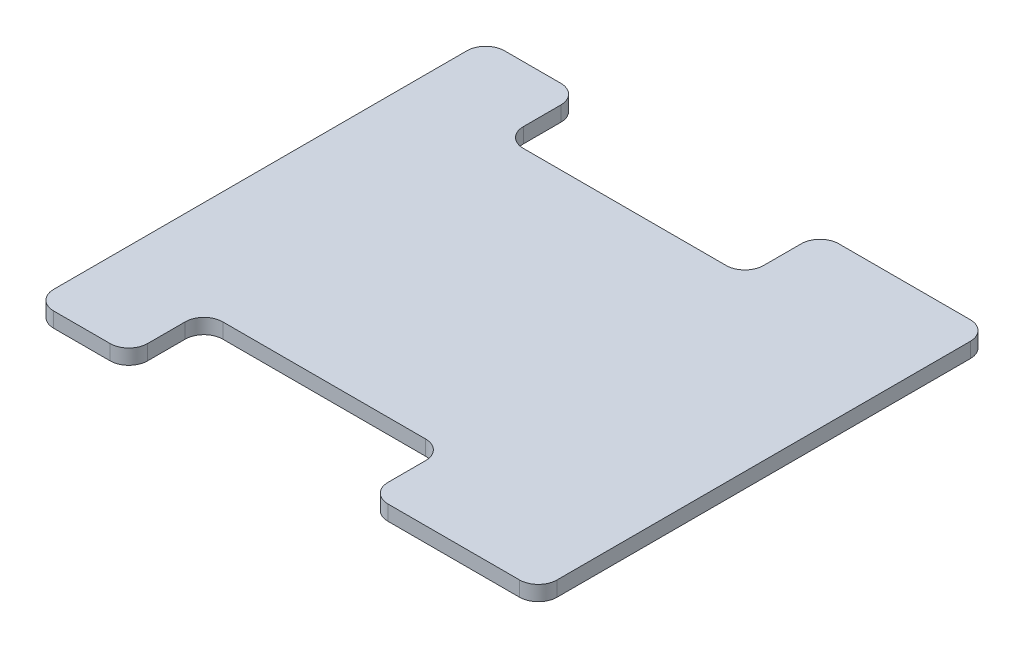
ISO-10303-21;
HEADER;
FILE_DESCRIPTION(('STEP AP214'),'2;1');
FILE_NAME('part.step','',(''),(''),'','','');
FILE_SCHEMA(('AUTOMOTIVE_DESIGN { 1 0 10303 214 1 1 1 1 }'));
ENDSEC;
DATA;
#1=APPLICATION_CONTEXT('core data for automotive mechanical design processes');
#2=APPLICATION_PROTOCOL_DEFINITION('international standard','automotive_design',2000,#1);
#3=PRODUCT_CONTEXT('',#1,'mechanical');
#4=PRODUCT('Part','Part','',(#3));
#5=PRODUCT_RELATED_PRODUCT_CATEGORY('part','',(#4));
#6=PRODUCT_DEFINITION_FORMATION('','',#4);
#7=PRODUCT_DEFINITION_CONTEXT('part definition',#1,'design');
#8=PRODUCT_DEFINITION('design','',#6,#7);
#9=PRODUCT_DEFINITION_SHAPE('','',#8);
#10=(LENGTH_UNIT() NAMED_UNIT(*) SI_UNIT(.MILLI.,.METRE.));
#11=(NAMED_UNIT(*) PLANE_ANGLE_UNIT() SI_UNIT($,.RADIAN.));
#12=(NAMED_UNIT(*) SI_UNIT($,.STERADIAN.) SOLID_ANGLE_UNIT());
#13=UNCERTAINTY_MEASURE_WITH_UNIT(LENGTH_MEASURE(1.E-05),#10,'distance_accuracy_value','');
#14=(GEOMETRIC_REPRESENTATION_CONTEXT(3) GLOBAL_UNCERTAINTY_ASSIGNED_CONTEXT((#13)) GLOBAL_UNIT_ASSIGNED_CONTEXT((#10,
#11,#12)) REPRESENTATION_CONTEXT('',''));
#15=CARTESIAN_POINT('',(0.,0.,0.));
#16=DIRECTION('',(0.,0.,1.));
#17=DIRECTION('',(1.,0.,0.));
#18=AXIS2_PLACEMENT_3D('',#15,#16,#17);
#19=CARTESIAN_POINT('',(62.,4.,55.));
#20=DIRECTION('',(0.,-1.,0.));
#21=DIRECTION('',(0.,0.,-1.));
#22=AXIS2_PLACEMENT_3D('',#19,#20,#21);
#23=CYLINDRICAL_SURFACE('',#22,4.99999999999999);
#24=CARTESIAN_POINT('',(62.,0.,55.));
#25=DIRECTION('',(0.,1.,0.));
#26=DIRECTION('',(0.,0.,-1.));
#27=AXIS2_PLACEMENT_3D('',#24,#25,#26);
#28=CIRCLE('',#27,4.99999999999999);
#29=CARTESIAN_POINT('',(62.,0.,60.));
#30=VERTEX_POINT('',#29);
#31=CARTESIAN_POINT('',(67.,0.,55.));
#32=VERTEX_POINT('',#31);
#33=EDGE_CURVE('E225',#30,#32,#28,.T.);
#34=ORIENTED_EDGE('',*,*,#33,.T.);
#35=DIRECTION('',(0.,-1.,0.));
#36=VECTOR('',#35,1.);
#37=CARTESIAN_POINT('',(67.,4.,55.));
#38=LINE('',#37,#36);
#39=CARTESIAN_POINT('',(67.,4.,55.));
#40=VERTEX_POINT('',#39);
#41=EDGE_CURVE('E11',#40,#32,#38,.T.);
#42=ORIENTED_EDGE('',*,*,#41,.F.);
#43=CARTESIAN_POINT('',(62.,4.,55.));
#44=DIRECTION('',(0.,1.,0.));
#45=DIRECTION('',(0.,0.,-1.));
#46=AXIS2_PLACEMENT_3D('',#43,#44,#45);
#47=CIRCLE('',#46,4.99999999999999);
#48=CARTESIAN_POINT('',(62.,4.,60.));
#49=VERTEX_POINT('',#48);
#50=EDGE_CURVE('E271',#49,#40,#47,.T.);
#51=ORIENTED_EDGE('',*,*,#50,.F.);
#52=DIRECTION('',(0.,-1.,0.));
#53=VECTOR('',#52,1.);
#54=CARTESIAN_POINT('',(62.,4.,60.));
#55=LINE('',#54,#53);
#56=EDGE_CURVE('E221',#49,#30,#55,.T.);
#57=ORIENTED_EDGE('',*,*,#56,.T.);
#58=EDGE_LOOP('',(#34,#42,#51,#57));
#59=FACE_BOUND('',#58,.T.);
#60=ADVANCED_FACE('F33',(#59),#23,.T.);
#61=CARTESIAN_POINT('',(67.,4.,-55.));
#62=DIRECTION('',(-1.,0.,0.));
#63=DIRECTION('',(0.,0.,1.));
#64=AXIS2_PLACEMENT_3D('',#61,#62,#63);
#65=PLANE('',#64);
#66=DIRECTION('',(0.,0.,-1.));
#67=VECTOR('',#66,1.);
#68=CARTESIAN_POINT('',(67.,0.,-55.));
#69=LINE('',#68,#67);
#70=CARTESIAN_POINT('',(67.,0.,-55.));
#71=VERTEX_POINT('',#70);
#72=EDGE_CURVE('E228',#32,#71,#69,.T.);
#73=ORIENTED_EDGE('',*,*,#72,.T.);
#74=DIRECTION('',(0.,-1.,0.));
#75=VECTOR('',#74,1.);
#76=CARTESIAN_POINT('',(67.,4.,-55.));
#77=LINE('',#76,#75);
#78=CARTESIAN_POINT('',(67.,4.,-55.));
#79=VERTEX_POINT('',#78);
#80=EDGE_CURVE('E41',#79,#71,#77,.T.);
#81=ORIENTED_EDGE('',*,*,#80,.F.);
#82=DIRECTION('',(0.,0.,-1.));
#83=VECTOR('',#82,1.);
#84=CARTESIAN_POINT('',(67.,4.,-55.));
#85=LINE('',#84,#83);
#86=EDGE_CURVE('E140',#40,#79,#85,.T.);
#87=ORIENTED_EDGE('',*,*,#86,.F.);
#88=ORIENTED_EDGE('',*,*,#41,.T.);
#89=EDGE_LOOP('',(#73,#81,#87,#88));
#90=FACE_BOUND('',#89,.T.);
#91=ADVANCED_FACE('F409',(#90),#65,.F.);
#92=CARTESIAN_POINT('',(62.,4.,-55.));
#93=DIRECTION('',(0.,-1.,0.));
#94=DIRECTION('',(0.,0.,-1.));
#95=AXIS2_PLACEMENT_3D('',#92,#93,#94);
#96=CYLINDRICAL_SURFACE('',#95,5.);
#97=CARTESIAN_POINT('',(62.,0.,-55.));
#98=DIRECTION('',(0.,1.,0.));
#99=DIRECTION('',(0.,0.,-1.));
#100=AXIS2_PLACEMENT_3D('',#97,#98,#99);
#101=CIRCLE('',#100,5.);
#102=CARTESIAN_POINT('',(62.,0.,-60.));
#103=VERTEX_POINT('',#102);
#104=EDGE_CURVE('E230',#71,#103,#101,.T.);
#105=ORIENTED_EDGE('',*,*,#104,.T.);
#106=DIRECTION('',(0.,-1.,0.));
#107=VECTOR('',#106,1.);
#108=CARTESIAN_POINT('',(62.,4.,-60.));
#109=LINE('',#108,#107);
#110=CARTESIAN_POINT('',(62.,4.,-60.));
#111=VERTEX_POINT('',#110);
#112=EDGE_CURVE('E326',#111,#103,#109,.T.);
#113=ORIENTED_EDGE('',*,*,#112,.F.);
#114=CARTESIAN_POINT('',(62.,4.,-55.));
#115=DIRECTION('',(0.,1.,0.));
#116=DIRECTION('',(0.,0.,-1.));
#117=AXIS2_PLACEMENT_3D('',#114,#115,#116);
#118=CIRCLE('',#117,5.);
#119=EDGE_CURVE('E334',#79,#111,#118,.T.);
#120=ORIENTED_EDGE('',*,*,#119,.F.);
#121=ORIENTED_EDGE('',*,*,#80,.T.);
#122=EDGE_LOOP('',(#105,#113,#120,#121));
#123=FACE_BOUND('',#122,.T.);
#124=ADVANCED_FACE('F332',(#123),#96,.T.);
#125=CARTESIAN_POINT('',(62.,4.,-60.));
#126=DIRECTION('',(0.,0.,1.));
#127=DIRECTION('',(1.,0.,0.));
#128=AXIS2_PLACEMENT_3D('',#125,#126,#127);
#129=PLANE('',#128);
#130=DIRECTION('',(-1.,0.,0.));
#131=VECTOR('',#130,1.);
#132=CARTESIAN_POINT('',(62.,0.,-60.));
#133=LINE('',#132,#131);
#134=CARTESIAN_POINT('',(27.,0.,-60.));
#135=VERTEX_POINT('',#134);
#136=EDGE_CURVE('E232',#103,#135,#133,.T.);
#137=ORIENTED_EDGE('',*,*,#136,.T.);
#138=DIRECTION('',(0.,-1.,0.));
#139=VECTOR('',#138,1.);
#140=CARTESIAN_POINT('',(27.,4.,-60.));
#141=LINE('',#140,#139);
#142=CARTESIAN_POINT('',(27.,4.,-60.));
#143=VERTEX_POINT('',#142);
#144=EDGE_CURVE('E323',#143,#135,#141,.T.);
#145=ORIENTED_EDGE('',*,*,#144,.F.);
#146=DIRECTION('',(-1.,0.,0.));
#147=VECTOR('',#146,1.);
#148=CARTESIAN_POINT('',(62.,4.,-60.));
#149=LINE('',#148,#147);
#150=EDGE_CURVE('E352',#111,#143,#149,.T.);
#151=ORIENTED_EDGE('',*,*,#150,.F.);
#152=ORIENTED_EDGE('',*,*,#112,.T.);
#153=EDGE_LOOP('',(#137,#145,#151,#152));
#154=FACE_BOUND('',#153,.T.);
#155=ADVANCED_FACE('F343',(#154),#129,.F.);
#156=CARTESIAN_POINT('',(27.,4.,-55.));
#157=DIRECTION('',(0.,-1.,0.));
#158=DIRECTION('',(0.,0.,-1.));
#159=AXIS2_PLACEMENT_3D('',#156,#157,#158);
#160=CYLINDRICAL_SURFACE('',#159,5.);
#161=CARTESIAN_POINT('',(27.,0.,-55.));
#162=DIRECTION('',(0.,1.,0.));
#163=DIRECTION('',(0.,0.,1.));
#164=AXIS2_PLACEMENT_3D('',#161,#162,#163);
#165=CIRCLE('',#164,5.);
#166=CARTESIAN_POINT('',(22.,0.,-55.));
#167=VERTEX_POINT('',#166);
#168=EDGE_CURVE('E234',#135,#167,#165,.T.);
#169=ORIENTED_EDGE('',*,*,#168,.T.);
#170=DIRECTION('',(0.,-1.,0.));
#171=VECTOR('',#170,1.);
#172=CARTESIAN_POINT('',(22.,4.,-55.));
#173=LINE('',#172,#171);
#174=CARTESIAN_POINT('',(22.,4.,-55.));
#175=VERTEX_POINT('',#174);
#176=EDGE_CURVE('E320',#175,#167,#173,.T.);
#177=ORIENTED_EDGE('',*,*,#176,.F.);
#178=CARTESIAN_POINT('',(27.,4.,-55.));
#179=DIRECTION('',(0.,1.,0.));
#180=DIRECTION('',(0.,0.,1.));
#181=AXIS2_PLACEMENT_3D('',#178,#179,#180);
#182=CIRCLE('',#181,5.);
#183=EDGE_CURVE('E349',#143,#175,#182,.T.);
#184=ORIENTED_EDGE('',*,*,#183,.F.);
#185=ORIENTED_EDGE('',*,*,#144,.T.);
#186=EDGE_LOOP('',(#169,#177,#184,#185));
#187=FACE_BOUND('',#186,.T.);
#188=ADVANCED_FACE('F347',(#187),#160,.T.);
#189=CARTESIAN_POINT('',(22.,4.,-55.));
#190=DIRECTION('',(1.,0.,0.));
#191=DIRECTION('',(0.,0.,-1.));
#192=AXIS2_PLACEMENT_3D('',#189,#190,#191);
#193=PLANE('',#192);
#194=DIRECTION('',(0.,0.,1.));
#195=VECTOR('',#194,1.);
#196=CARTESIAN_POINT('',(22.,0.,-55.));
#197=LINE('',#196,#195);
#198=CARTESIAN_POINT('',(22.,0.,-45.));
#199=VERTEX_POINT('',#198);
#200=EDGE_CURVE('E236',#167,#199,#197,.T.);
#201=ORIENTED_EDGE('',*,*,#200,.T.);
#202=DIRECTION('',(0.,-1.,0.));
#203=VECTOR('',#202,1.);
#204=CARTESIAN_POINT('',(22.,4.,-45.));
#205=LINE('',#204,#203);
#206=CARTESIAN_POINT('',(22.,4.,-45.));
#207=VERTEX_POINT('',#206);
#208=EDGE_CURVE('E317',#207,#199,#205,.T.);
#209=ORIENTED_EDGE('',*,*,#208,.F.);
#210=DIRECTION('',(0.,0.,1.));
#211=VECTOR('',#210,1.);
#212=CARTESIAN_POINT('',(22.,4.,-55.));
#213=LINE('',#212,#211);
#214=EDGE_CURVE('E351',#175,#207,#213,.T.);
#215=ORIENTED_EDGE('',*,*,#214,.F.);
#216=ORIENTED_EDGE('',*,*,#176,.T.);
#217=EDGE_LOOP('',(#201,#209,#215,#216));
#218=FACE_BOUND('',#217,.T.);
#219=ADVANCED_FACE('F422',(#218),#193,.F.);
#220=CARTESIAN_POINT('',(17.,4.,-45.));
#221=DIRECTION('',(0.,-1.,0.));
#222=DIRECTION('',(0.,0.,-1.));
#223=AXIS2_PLACEMENT_3D('',#220,#221,#222);
#224=CYLINDRICAL_SURFACE('',#223,5.);
#225=CARTESIAN_POINT('',(17.,0.,-45.));
#226=DIRECTION('',(0.,-1.,0.));
#227=DIRECTION('',(0.,0.,1.));
#228=AXIS2_PLACEMENT_3D('',#225,#226,#227);
#229=CIRCLE('',#228,5.);
#230=CARTESIAN_POINT('',(17.,0.,-40.));
#231=VERTEX_POINT('',#230);
#232=EDGE_CURVE('E238',#199,#231,#229,.T.);
#233=ORIENTED_EDGE('',*,*,#232,.T.);
#234=DIRECTION('',(0.,-1.,0.));
#235=VECTOR('',#234,1.);
#236=CARTESIAN_POINT('',(17.,4.,-40.));
#237=LINE('',#236,#235);
#238=CARTESIAN_POINT('',(17.,4.,-40.));
#239=VERTEX_POINT('',#238);
#240=EDGE_CURVE('E314',#239,#231,#237,.T.);
#241=ORIENTED_EDGE('',*,*,#240,.F.);
#242=CARTESIAN_POINT('',(17.,4.,-45.));
#243=DIRECTION('',(0.,-1.,0.));
#244=DIRECTION('',(0.,0.,1.));
#245=AXIS2_PLACEMENT_3D('',#242,#243,#244);
#246=CIRCLE('',#245,5.);
#247=EDGE_CURVE('E354',#207,#239,#246,.T.);
#248=ORIENTED_EDGE('',*,*,#247,.F.);
#249=ORIENTED_EDGE('',*,*,#208,.T.);
#250=EDGE_LOOP('',(#233,#241,#248,#249));
#251=FACE_BOUND('',#250,.T.);
#252=ADVANCED_FACE('F425',(#251),#224,.F.);
#253=CARTESIAN_POINT('',(-37.,4.,-40.));
#254=DIRECTION('',(0.,0.,1.));
#255=DIRECTION('',(1.,0.,0.));
#256=AXIS2_PLACEMENT_3D('',#253,#254,#255);
#257=PLANE('',#256);
#258=DIRECTION('',(-1.,0.,0.));
#259=VECTOR('',#258,1.);
#260=CARTESIAN_POINT('',(-37.,0.,-40.));
#261=LINE('',#260,#259);
#262=CARTESIAN_POINT('',(-37.,0.,-40.));
#263=VERTEX_POINT('',#262);
#264=EDGE_CURVE('E240',#231,#263,#261,.T.);
#265=ORIENTED_EDGE('',*,*,#264,.T.);
#266=DIRECTION('',(0.,-1.,0.));
#267=VECTOR('',#266,1.);
#268=CARTESIAN_POINT('',(-37.,4.,-40.));
#269=LINE('',#268,#267);
#270=CARTESIAN_POINT('',(-37.,4.,-40.));
#271=VERTEX_POINT('',#270);
#272=EDGE_CURVE('E311',#271,#263,#269,.T.);
#273=ORIENTED_EDGE('',*,*,#272,.F.);
#274=DIRECTION('',(-1.,0.,0.));
#275=VECTOR('',#274,1.);
#276=CARTESIAN_POINT('',(-37.,4.,-40.));
#277=LINE('',#276,#275);
#278=EDGE_CURVE('E360',#239,#271,#277,.T.);
#279=ORIENTED_EDGE('',*,*,#278,.F.);
#280=ORIENTED_EDGE('',*,*,#240,.T.);
#281=EDGE_LOOP('',(#265,#273,#279,#280));
#282=FACE_BOUND('',#281,.T.);
#283=ADVANCED_FACE('F429',(#282),#257,.F.);
#284=CARTESIAN_POINT('',(-37.,4.,-45.));
#285=DIRECTION('',(0.,-1.,0.));
#286=DIRECTION('',(0.,0.,-1.));
#287=AXIS2_PLACEMENT_3D('',#284,#285,#286);
#288=CYLINDRICAL_SURFACE('',#287,5.);
#289=CARTESIAN_POINT('',(-37.,0.,-45.));
#290=DIRECTION('',(0.,-1.,0.));
#291=DIRECTION('',(0.,0.,1.));
#292=AXIS2_PLACEMENT_3D('',#289,#290,#291);
#293=CIRCLE('',#292,5.);
#294=CARTESIAN_POINT('',(-42.,0.,-45.));
#295=VERTEX_POINT('',#294);
#296=EDGE_CURVE('E242',#263,#295,#293,.T.);
#297=ORIENTED_EDGE('',*,*,#296,.T.);
#298=DIRECTION('',(0.,-1.,0.));
#299=VECTOR('',#298,1.);
#300=CARTESIAN_POINT('',(-42.,4.,-45.));
#301=LINE('',#300,#299);
#302=CARTESIAN_POINT('',(-42.,4.,-45.));
#303=VERTEX_POINT('',#302);
#304=EDGE_CURVE('E308',#303,#295,#301,.T.);
#305=ORIENTED_EDGE('',*,*,#304,.F.);
#306=CARTESIAN_POINT('',(-37.,4.,-45.));
#307=DIRECTION('',(0.,-1.,0.));
#308=DIRECTION('',(0.,0.,1.));
#309=AXIS2_PLACEMENT_3D('',#306,#307,#308);
#310=CIRCLE('',#309,5.);
#311=EDGE_CURVE('E362',#271,#303,#310,.T.);
#312=ORIENTED_EDGE('',*,*,#311,.F.);
#313=ORIENTED_EDGE('',*,*,#272,.T.);
#314=EDGE_LOOP('',(#297,#305,#312,#313));
#315=FACE_BOUND('',#314,.T.);
#316=ADVANCED_FACE('F433',(#315),#288,.F.);
#317=CARTESIAN_POINT('',(-42.,4.,-55.));
#318=DIRECTION('',(-1.,0.,0.));
#319=DIRECTION('',(0.,0.,1.));
#320=AXIS2_PLACEMENT_3D('',#317,#318,#319);
#321=PLANE('',#320);
#322=DIRECTION('',(0.,0.,-1.));
#323=VECTOR('',#322,1.);
#324=CARTESIAN_POINT('',(-42.,0.,-55.));
#325=LINE('',#324,#323);
#326=CARTESIAN_POINT('',(-42.,0.,-55.));
#327=VERTEX_POINT('',#326);
#328=EDGE_CURVE('E244',#295,#327,#325,.T.);
#329=ORIENTED_EDGE('',*,*,#328,.T.);
#330=DIRECTION('',(0.,-1.,0.));
#331=VECTOR('',#330,1.);
#332=CARTESIAN_POINT('',(-42.,4.,-55.));
#333=LINE('',#332,#331);
#334=CARTESIAN_POINT('',(-42.,4.,-55.));
#335=VERTEX_POINT('',#334);
#336=EDGE_CURVE('E305',#335,#327,#333,.T.);
#337=ORIENTED_EDGE('',*,*,#336,.F.);
#338=DIRECTION('',(0.,0.,-1.));
#339=VECTOR('',#338,1.);
#340=CARTESIAN_POINT('',(-42.,4.,-55.));
#341=LINE('',#340,#339);
#342=EDGE_CURVE('E364',#303,#335,#341,.T.);
#343=ORIENTED_EDGE('',*,*,#342,.F.);
#344=ORIENTED_EDGE('',*,*,#304,.T.);
#345=EDGE_LOOP('',(#329,#337,#343,#344));
#346=FACE_BOUND('',#345,.T.);
#347=ADVANCED_FACE('F437',(#346),#321,.F.);
#348=CARTESIAN_POINT('',(-47.,4.,-55.));
#349=DIRECTION('',(0.,-1.,0.));
#350=DIRECTION('',(0.,0.,-1.));
#351=AXIS2_PLACEMENT_3D('',#348,#349,#350);
#352=CYLINDRICAL_SURFACE('',#351,5.);
#353=CARTESIAN_POINT('',(-47.,0.,-55.));
#354=DIRECTION('',(0.,1.,0.));
#355=DIRECTION('',(0.,0.,-1.));
#356=AXIS2_PLACEMENT_3D('',#353,#354,#355);
#357=CIRCLE('',#356,5.);
#358=CARTESIAN_POINT('',(-47.,0.,-60.));
#359=VERTEX_POINT('',#358);
#360=EDGE_CURVE('E246',#327,#359,#357,.T.);
#361=ORIENTED_EDGE('',*,*,#360,.T.);
#362=DIRECTION('',(0.,-1.,0.));
#363=VECTOR('',#362,1.);
#364=CARTESIAN_POINT('',(-47.,4.,-60.));
#365=LINE('',#364,#363);
#366=CARTESIAN_POINT('',(-47.,4.,-60.));
#367=VERTEX_POINT('',#366);
#368=EDGE_CURVE('E302',#367,#359,#365,.T.);
#369=ORIENTED_EDGE('',*,*,#368,.F.);
#370=CARTESIAN_POINT('',(-47.,4.,-55.));
#371=DIRECTION('',(0.,1.,0.));
#372=DIRECTION('',(0.,0.,-1.));
#373=AXIS2_PLACEMENT_3D('',#370,#371,#372);
#374=CIRCLE('',#373,5.);
#375=EDGE_CURVE('E366',#335,#367,#374,.T.);
#376=ORIENTED_EDGE('',*,*,#375,.F.);
#377=ORIENTED_EDGE('',*,*,#336,.T.);
#378=EDGE_LOOP('',(#361,#369,#376,#377));
#379=FACE_BOUND('',#378,.T.);
#380=ADVANCED_FACE('F441',(#379),#352,.T.);
#381=CARTESIAN_POINT('',(-47.,4.,-60.));
#382=DIRECTION('',(0.,0.,1.));
#383=DIRECTION('',(1.,0.,0.));
#384=AXIS2_PLACEMENT_3D('',#381,#382,#383);
#385=PLANE('',#384);
#386=DIRECTION('',(-1.,0.,0.));
#387=VECTOR('',#386,1.);
#388=CARTESIAN_POINT('',(-47.,0.,-60.));
#389=LINE('',#388,#387);
#390=CARTESIAN_POINT('',(-62.,0.,-60.));
#391=VERTEX_POINT('',#390);
#392=EDGE_CURVE('E248',#359,#391,#389,.T.);
#393=ORIENTED_EDGE('',*,*,#392,.T.);
#394=DIRECTION('',(0.,-1.,0.));
#395=VECTOR('',#394,1.);
#396=CARTESIAN_POINT('',(-62.,4.,-60.));
#397=LINE('',#396,#395);
#398=CARTESIAN_POINT('',(-62.,4.,-60.));
#399=VERTEX_POINT('',#398);
#400=EDGE_CURVE('E299',#399,#391,#397,.T.);
#401=ORIENTED_EDGE('',*,*,#400,.F.);
#402=DIRECTION('',(-1.,0.,0.));
#403=VECTOR('',#402,1.);
#404=CARTESIAN_POINT('',(-47.,4.,-60.));
#405=LINE('',#404,#403);
#406=EDGE_CURVE('E368',#367,#399,#405,.T.);
#407=ORIENTED_EDGE('',*,*,#406,.F.);
#408=ORIENTED_EDGE('',*,*,#368,.T.);
#409=EDGE_LOOP('',(#393,#401,#407,#408));
#410=FACE_BOUND('',#409,.T.);
#411=ADVANCED_FACE('F445',(#410),#385,.F.);
#412=CARTESIAN_POINT('',(-62.,4.,-55.));
#413=DIRECTION('',(0.,-1.,0.));
#414=DIRECTION('',(0.,0.,-1.));
#415=AXIS2_PLACEMENT_3D('',#412,#413,#414);
#416=CYLINDRICAL_SURFACE('',#415,4.99999999999999);
#417=CARTESIAN_POINT('',(-62.,0.,-55.));
#418=DIRECTION('',(0.,1.,0.));
#419=DIRECTION('',(0.,0.,1.));
#420=AXIS2_PLACEMENT_3D('',#417,#418,#419);
#421=CIRCLE('',#420,4.99999999999999);
#422=CARTESIAN_POINT('',(-67.,0.,-55.));
#423=VERTEX_POINT('',#422);
#424=EDGE_CURVE('E250',#391,#423,#421,.T.);
#425=ORIENTED_EDGE('',*,*,#424,.T.);
#426=DIRECTION('',(0.,-1.,0.));
#427=VECTOR('',#426,1.);
#428=CARTESIAN_POINT('',(-67.,4.,-55.));
#429=LINE('',#428,#427);
#430=CARTESIAN_POINT('',(-67.,4.,-55.));
#431=VERTEX_POINT('',#430);
#432=EDGE_CURVE('E296',#431,#423,#429,.T.);
#433=ORIENTED_EDGE('',*,*,#432,.F.);
#434=CARTESIAN_POINT('',(-62.,4.,-55.));
#435=DIRECTION('',(0.,1.,0.));
#436=DIRECTION('',(0.,0.,1.));
#437=AXIS2_PLACEMENT_3D('',#434,#435,#436);
#438=CIRCLE('',#437,4.99999999999999);
#439=EDGE_CURVE('E370',#399,#431,#438,.T.);
#440=ORIENTED_EDGE('',*,*,#439,.F.);
#441=ORIENTED_EDGE('',*,*,#400,.T.);
#442=EDGE_LOOP('',(#425,#433,#440,#441));
#443=FACE_BOUND('',#442,.T.);
#444=ADVANCED_FACE('F449',(#443),#416,.T.);
#445=CARTESIAN_POINT('',(-67.,4.,-55.));
#446=DIRECTION('',(1.,0.,0.));
#447=DIRECTION('',(0.,0.,-1.));
#448=AXIS2_PLACEMENT_3D('',#445,#446,#447);
#449=PLANE('',#448);
#450=DIRECTION('',(0.,0.,1.));
#451=VECTOR('',#450,1.);
#452=CARTESIAN_POINT('',(-67.,0.,-55.));
#453=LINE('',#452,#451);
#454=CARTESIAN_POINT('',(-67.,0.,55.));
#455=VERTEX_POINT('',#454);
#456=EDGE_CURVE('E252',#423,#455,#453,.T.);
#457=ORIENTED_EDGE('',*,*,#456,.T.);
#458=DIRECTION('',(0.,-1.,0.));
#459=VECTOR('',#458,1.);
#460=CARTESIAN_POINT('',(-67.,4.,55.));
#461=LINE('',#460,#459);
#462=CARTESIAN_POINT('',(-67.,4.,55.));
#463=VERTEX_POINT('',#462);
#464=EDGE_CURVE('E293',#463,#455,#461,.T.);
#465=ORIENTED_EDGE('',*,*,#464,.F.);
#466=DIRECTION('',(0.,0.,1.));
#467=VECTOR('',#466,1.);
#468=CARTESIAN_POINT('',(-67.,4.,-55.));
#469=LINE('',#468,#467);
#470=EDGE_CURVE('E372',#431,#463,#469,.T.);
#471=ORIENTED_EDGE('',*,*,#470,.F.);
#472=ORIENTED_EDGE('',*,*,#432,.T.);
#473=EDGE_LOOP('',(#457,#465,#471,#472));
#474=FACE_BOUND('',#473,.T.);
#475=ADVANCED_FACE('F453',(#474),#449,.F.);
#476=CARTESIAN_POINT('',(-62.,4.,55.));
#477=DIRECTION('',(0.,-1.,0.));
#478=DIRECTION('',(0.,0.,-1.));
#479=AXIS2_PLACEMENT_3D('',#476,#477,#478);
#480=CYLINDRICAL_SURFACE('',#479,5.);
#481=CARTESIAN_POINT('',(-62.,0.,55.));
#482=DIRECTION('',(0.,1.,0.));
#483=DIRECTION('',(0.,0.,-1.));
#484=AXIS2_PLACEMENT_3D('',#481,#482,#483);
#485=CIRCLE('',#484,5.);
#486=CARTESIAN_POINT('',(-62.,0.,60.));
#487=VERTEX_POINT('',#486);
#488=EDGE_CURVE('E254',#455,#487,#485,.T.);
#489=ORIENTED_EDGE('',*,*,#488,.T.);
#490=DIRECTION('',(0.,-1.,0.));
#491=VECTOR('',#490,1.);
#492=CARTESIAN_POINT('',(-62.,4.,60.));
#493=LINE('',#492,#491);
#494=CARTESIAN_POINT('',(-62.,4.,60.));
#495=VERTEX_POINT('',#494);
#496=EDGE_CURVE('E290',#495,#487,#493,.T.);
#497=ORIENTED_EDGE('',*,*,#496,.F.);
#498=CARTESIAN_POINT('',(-62.,4.,55.));
#499=DIRECTION('',(0.,1.,0.));
#500=DIRECTION('',(0.,0.,-1.));
#501=AXIS2_PLACEMENT_3D('',#498,#499,#500);
#502=CIRCLE('',#501,5.);
#503=EDGE_CURVE('E374',#463,#495,#502,.T.);
#504=ORIENTED_EDGE('',*,*,#503,.F.);
#505=ORIENTED_EDGE('',*,*,#464,.T.);
#506=EDGE_LOOP('',(#489,#497,#504,#505));
#507=FACE_BOUND('',#506,.T.);
#508=ADVANCED_FACE('F457',(#507),#480,.T.);
#509=CARTESIAN_POINT('',(-47.,4.,60.));
#510=DIRECTION('',(0.,0.,-1.));
#511=DIRECTION('',(-1.,0.,0.));
#512=AXIS2_PLACEMENT_3D('',#509,#510,#511);
#513=PLANE('',#512);
#514=DIRECTION('',(1.,0.,0.));
#515=VECTOR('',#514,1.);
#516=CARTESIAN_POINT('',(-47.,0.,60.));
#517=LINE('',#516,#515);
#518=CARTESIAN_POINT('',(-47.,0.,60.));
#519=VERTEX_POINT('',#518);
#520=EDGE_CURVE('E256',#487,#519,#517,.T.);
#521=ORIENTED_EDGE('',*,*,#520,.T.);
#522=DIRECTION('',(0.,-1.,0.));
#523=VECTOR('',#522,1.);
#524=CARTESIAN_POINT('',(-47.,4.,60.));
#525=LINE('',#524,#523);
#526=CARTESIAN_POINT('',(-47.,4.,60.));
#527=VERTEX_POINT('',#526);
#528=EDGE_CURVE('E287',#527,#519,#525,.T.);
#529=ORIENTED_EDGE('',*,*,#528,.F.);
#530=DIRECTION('',(1.,0.,0.));
#531=VECTOR('',#530,1.);
#532=CARTESIAN_POINT('',(-47.,4.,60.));
#533=LINE('',#532,#531);
#534=EDGE_CURVE('E376',#495,#527,#533,.T.);
#535=ORIENTED_EDGE('',*,*,#534,.F.);
#536=ORIENTED_EDGE('',*,*,#496,.T.);
#537=EDGE_LOOP('',(#521,#529,#535,#536));
#538=FACE_BOUND('',#537,.T.);
#539=ADVANCED_FACE('F461',(#538),#513,.F.);
#540=CARTESIAN_POINT('',(-47.,4.,55.));
#541=DIRECTION('',(0.,-1.,0.));
#542=DIRECTION('',(0.,0.,-1.));
#543=AXIS2_PLACEMENT_3D('',#540,#541,#542);
#544=CYLINDRICAL_SURFACE('',#543,5.);
#545=CARTESIAN_POINT('',(-47.,0.,55.));
#546=DIRECTION('',(0.,1.,0.));
#547=DIRECTION('',(0.,0.,1.));
#548=AXIS2_PLACEMENT_3D('',#545,#546,#547);
#549=CIRCLE('',#548,5.);
#550=CARTESIAN_POINT('',(-42.,0.,55.));
#551=VERTEX_POINT('',#550);
#552=EDGE_CURVE('E258',#519,#551,#549,.T.);
#553=ORIENTED_EDGE('',*,*,#552,.T.);
#554=DIRECTION('',(0.,-1.,0.));
#555=VECTOR('',#554,1.);
#556=CARTESIAN_POINT('',(-42.,4.,55.));
#557=LINE('',#556,#555);
#558=CARTESIAN_POINT('',(-42.,4.,55.));
#559=VERTEX_POINT('',#558);
#560=EDGE_CURVE('E284',#559,#551,#557,.T.);
#561=ORIENTED_EDGE('',*,*,#560,.F.);
#562=CARTESIAN_POINT('',(-47.,4.,55.));
#563=DIRECTION('',(0.,1.,0.));
#564=DIRECTION('',(0.,0.,1.));
#565=AXIS2_PLACEMENT_3D('',#562,#563,#564);
#566=CIRCLE('',#565,5.);
#567=EDGE_CURVE('E378',#527,#559,#566,.T.);
#568=ORIENTED_EDGE('',*,*,#567,.F.);
#569=ORIENTED_EDGE('',*,*,#528,.T.);
#570=EDGE_LOOP('',(#553,#561,#568,#569));
#571=FACE_BOUND('',#570,.T.);
#572=ADVANCED_FACE('F465',(#571),#544,.T.);
#573=CARTESIAN_POINT('',(-42.,4.,55.));
#574=DIRECTION('',(-1.,0.,0.));
#575=DIRECTION('',(0.,0.,1.));
#576=AXIS2_PLACEMENT_3D('',#573,#574,#575);
#577=PLANE('',#576);
#578=DIRECTION('',(0.,0.,-1.));
#579=VECTOR('',#578,1.);
#580=CARTESIAN_POINT('',(-42.,0.,55.));
#581=LINE('',#580,#579);
#582=CARTESIAN_POINT('',(-42.,0.,45.));
#583=VERTEX_POINT('',#582);
#584=EDGE_CURVE('E260',#551,#583,#581,.T.);
#585=ORIENTED_EDGE('',*,*,#584,.T.);
#586=DIRECTION('',(0.,-1.,0.));
#587=VECTOR('',#586,1.);
#588=CARTESIAN_POINT('',(-42.,4.,45.));
#589=LINE('',#588,#587);
#590=CARTESIAN_POINT('',(-42.,4.,45.));
#591=VERTEX_POINT('',#590);
#592=EDGE_CURVE('E281',#591,#583,#589,.T.);
#593=ORIENTED_EDGE('',*,*,#592,.F.);
#594=DIRECTION('',(0.,0.,-1.));
#595=VECTOR('',#594,1.);
#596=CARTESIAN_POINT('',(-42.,4.,55.));
#597=LINE('',#596,#595);
#598=EDGE_CURVE('E380',#559,#591,#597,.T.);
#599=ORIENTED_EDGE('',*,*,#598,.F.);
#600=ORIENTED_EDGE('',*,*,#560,.T.);
#601=EDGE_LOOP('',(#585,#593,#599,#600));
#602=FACE_BOUND('',#601,.T.);
#603=ADVANCED_FACE('F469',(#602),#577,.F.);
#604=CARTESIAN_POINT('',(-37.,4.,45.));
#605=DIRECTION('',(0.,-1.,0.));
#606=DIRECTION('',(0.,0.,-1.));
#607=AXIS2_PLACEMENT_3D('',#604,#605,#606);
#608=CYLINDRICAL_SURFACE('',#607,5.);
#609=CARTESIAN_POINT('',(-37.,0.,45.));
#610=DIRECTION('',(0.,-1.,0.));
#611=DIRECTION('',(0.,0.,-1.));
#612=AXIS2_PLACEMENT_3D('',#609,#610,#611);
#613=CIRCLE('',#612,5.);
#614=CARTESIAN_POINT('',(-37.,0.,40.));
#615=VERTEX_POINT('',#614);
#616=EDGE_CURVE('E262',#583,#615,#613,.T.);
#617=ORIENTED_EDGE('',*,*,#616,.T.);
#618=DIRECTION('',(0.,-1.,0.));
#619=VECTOR('',#618,1.);
#620=CARTESIAN_POINT('',(-37.,4.,40.));
#621=LINE('',#620,#619);
#622=CARTESIAN_POINT('',(-37.,4.,40.));
#623=VERTEX_POINT('',#622);
#624=EDGE_CURVE('E278',#623,#615,#621,.T.);
#625=ORIENTED_EDGE('',*,*,#624,.F.);
#626=CARTESIAN_POINT('',(-37.,4.,45.));
#627=DIRECTION('',(0.,-1.,0.));
#628=DIRECTION('',(0.,0.,-1.));
#629=AXIS2_PLACEMENT_3D('',#626,#627,#628);
#630=CIRCLE('',#629,5.);
#631=EDGE_CURVE('E382',#591,#623,#630,.T.);
#632=ORIENTED_EDGE('',*,*,#631,.F.);
#633=ORIENTED_EDGE('',*,*,#592,.T.);
#634=EDGE_LOOP('',(#617,#625,#632,#633));
#635=FACE_BOUND('',#634,.T.);
#636=ADVANCED_FACE('F473',(#635),#608,.F.);
#637=CARTESIAN_POINT('',(-37.,4.,40.));
#638=DIRECTION('',(0.,0.,-1.));
#639=DIRECTION('',(-1.,0.,0.));
#640=AXIS2_PLACEMENT_3D('',#637,#638,#639);
#641=PLANE('',#640);
#642=DIRECTION('',(1.,0.,0.));
#643=VECTOR('',#642,1.);
#644=CARTESIAN_POINT('',(-37.,0.,40.));
#645=LINE('',#644,#643);
#646=CARTESIAN_POINT('',(17.,0.,40.));
#647=VERTEX_POINT('',#646);
#648=EDGE_CURVE('E264',#615,#647,#645,.T.);
#649=ORIENTED_EDGE('',*,*,#648,.T.);
#650=DIRECTION('',(0.,-1.,0.));
#651=VECTOR('',#650,1.);
#652=CARTESIAN_POINT('',(17.,4.,40.));
#653=LINE('',#652,#651);
#654=CARTESIAN_POINT('',(17.,4.,40.));
#655=VERTEX_POINT('',#654);
#656=EDGE_CURVE('E275',#655,#647,#653,.T.);
#657=ORIENTED_EDGE('',*,*,#656,.F.);
#658=DIRECTION('',(1.,0.,0.));
#659=VECTOR('',#658,1.);
#660=CARTESIAN_POINT('',(-37.,4.,40.));
#661=LINE('',#660,#659);
#662=EDGE_CURVE('E384',#623,#655,#661,.T.);
#663=ORIENTED_EDGE('',*,*,#662,.F.);
#664=ORIENTED_EDGE('',*,*,#624,.T.);
#665=EDGE_LOOP('',(#649,#657,#663,#664));
#666=FACE_BOUND('',#665,.T.);
#667=ADVANCED_FACE('F390',(#666),#641,.F.);
#668=CARTESIAN_POINT('',(17.,4.,45.));
#669=DIRECTION('',(0.,-1.,0.));
#670=DIRECTION('',(0.,0.,-1.));
#671=AXIS2_PLACEMENT_3D('',#668,#669,#670);
#672=CYLINDRICAL_SURFACE('',#671,5.);
#673=CARTESIAN_POINT('',(17.,0.,45.));
#674=DIRECTION('',(0.,-1.,0.));
#675=DIRECTION('',(0.,0.,-1.));
#676=AXIS2_PLACEMENT_3D('',#673,#674,#675);
#677=CIRCLE('',#676,5.);
#678=CARTESIAN_POINT('',(22.,0.,45.));
#679=VERTEX_POINT('',#678);
#680=EDGE_CURVE('E266',#647,#679,#677,.T.);
#681=ORIENTED_EDGE('',*,*,#680,.T.);
#682=DIRECTION('',(0.,-1.,0.));
#683=VECTOR('',#682,1.);
#684=CARTESIAN_POINT('',(22.,4.,45.));
#685=LINE('',#684,#683);
#686=CARTESIAN_POINT('',(22.,4.,45.));
#687=VERTEX_POINT('',#686);
#688=EDGE_CURVE('E216',#687,#679,#685,.T.);
#689=ORIENTED_EDGE('',*,*,#688,.F.);
#690=CARTESIAN_POINT('',(17.,4.,45.));
#691=DIRECTION('',(0.,-1.,0.));
#692=DIRECTION('',(0.,0.,-1.));
#693=AXIS2_PLACEMENT_3D('',#690,#691,#692);
#694=CIRCLE('',#693,5.);
#695=EDGE_CURVE('E207',#655,#687,#694,.T.);
#696=ORIENTED_EDGE('',*,*,#695,.F.);
#697=ORIENTED_EDGE('',*,*,#656,.T.);
#698=EDGE_LOOP('',(#681,#689,#696,#697));
#699=FACE_BOUND('',#698,.T.);
#700=ADVANCED_FACE('F394',(#699),#672,.F.);
#701=CARTESIAN_POINT('',(22.,4.,55.));
#702=DIRECTION('',(1.,0.,0.));
#703=DIRECTION('',(0.,0.,-1.));
#704=AXIS2_PLACEMENT_3D('',#701,#702,#703);
#705=PLANE('',#704);
#706=DIRECTION('',(0.,0.,1.));
#707=VECTOR('',#706,1.);
#708=CARTESIAN_POINT('',(22.,0.,55.));
#709=LINE('',#708,#707);
#710=CARTESIAN_POINT('',(22.,0.,55.));
#711=VERTEX_POINT('',#710);
#712=EDGE_CURVE('E215',#679,#711,#709,.T.);
#713=ORIENTED_EDGE('',*,*,#712,.T.);
#714=DIRECTION('',(0.,-1.,0.));
#715=VECTOR('',#714,1.);
#716=CARTESIAN_POINT('',(22.,4.,55.));
#717=LINE('',#716,#715);
#718=CARTESIAN_POINT('',(22.,4.,55.));
#719=VERTEX_POINT('',#718);
#720=EDGE_CURVE('E212',#719,#711,#717,.T.);
#721=ORIENTED_EDGE('',*,*,#720,.F.);
#722=DIRECTION('',(0.,0.,1.));
#723=VECTOR('',#722,1.);
#724=CARTESIAN_POINT('',(22.,4.,55.));
#725=LINE('',#724,#723);
#726=EDGE_CURVE('E201',#687,#719,#725,.T.);
#727=ORIENTED_EDGE('',*,*,#726,.F.);
#728=ORIENTED_EDGE('',*,*,#688,.T.);
#729=EDGE_LOOP('',(#713,#721,#727,#728));
#730=FACE_BOUND('',#729,.T.);
#731=ADVANCED_FACE('F213',(#730),#705,.F.);
#732=CARTESIAN_POINT('',(27.,4.,55.));
#733=DIRECTION('',(0.,-1.,0.));
#734=DIRECTION('',(0.,0.,-1.));
#735=AXIS2_PLACEMENT_3D('',#732,#733,#734);
#736=CYLINDRICAL_SURFACE('',#735,5.);
#737=CARTESIAN_POINT('',(27.,0.,55.));
#738=DIRECTION('',(0.,1.,0.));
#739=DIRECTION('',(0.,0.,-1.));
#740=AXIS2_PLACEMENT_3D('',#737,#738,#739);
#741=CIRCLE('',#740,5.);
#742=CARTESIAN_POINT('',(27.,0.,60.));
#743=VERTEX_POINT('',#742);
#744=EDGE_CURVE('E126',#711,#743,#741,.T.);
#745=ORIENTED_EDGE('',*,*,#744,.T.);
#746=DIRECTION('',(0.,-1.,0.));
#747=VECTOR('',#746,1.);
#748=CARTESIAN_POINT('',(27.,4.,60.));
#749=LINE('',#748,#747);
#750=CARTESIAN_POINT('',(27.,4.,60.));
#751=VERTEX_POINT('',#750);
#752=EDGE_CURVE('E217',#751,#743,#749,.T.);
#753=ORIENTED_EDGE('',*,*,#752,.F.);
#754=CARTESIAN_POINT('',(27.,4.,55.));
#755=DIRECTION('',(0.,1.,0.));
#756=DIRECTION('',(0.,0.,-1.));
#757=AXIS2_PLACEMENT_3D('',#754,#755,#756);
#758=CIRCLE('',#757,5.);
#759=EDGE_CURVE('E205',#719,#751,#758,.T.);
#760=ORIENTED_EDGE('',*,*,#759,.F.);
#761=ORIENTED_EDGE('',*,*,#720,.T.);
#762=EDGE_LOOP('',(#745,#753,#760,#761));
#763=FACE_BOUND('',#762,.T.);
#764=ADVANCED_FACE('F219',(#763),#736,.T.);
#765=CARTESIAN_POINT('',(62.,4.,60.));
#766=DIRECTION('',(0.,0.,-1.));
#767=DIRECTION('',(-1.,0.,0.));
#768=AXIS2_PLACEMENT_3D('',#765,#766,#767);
#769=PLANE('',#768);
#770=DIRECTION('',(1.,0.,0.));
#771=VECTOR('',#770,1.);
#772=CARTESIAN_POINT('',(62.,0.,60.));
#773=LINE('',#772,#771);
#774=EDGE_CURVE('E132',#743,#30,#773,.T.);
#775=ORIENTED_EDGE('',*,*,#774,.T.);
#776=ORIENTED_EDGE('',*,*,#56,.F.);
#777=DIRECTION('',(1.,0.,0.));
#778=VECTOR('',#777,1.);
#779=CARTESIAN_POINT('',(62.,4.,60.));
#780=LINE('',#779,#778);
#781=EDGE_CURVE('E49',#751,#49,#780,.T.);
#782=ORIENTED_EDGE('',*,*,#781,.F.);
#783=ORIENTED_EDGE('',*,*,#752,.T.);
#784=EDGE_LOOP('',(#775,#776,#782,#783));
#785=FACE_BOUND('',#784,.T.);
#786=ADVANCED_FACE('F398',(#785),#769,.F.);
#787=CARTESIAN_POINT('',(62.,4.,55.));
#788=DIRECTION('',(0.,-1.,0.));
#789=DIRECTION('',(0.,0.,-1.));
#790=AXIS2_PLACEMENT_3D('',#787,#788,#789);
#791=PLANE('',#790);
#792=ORIENTED_EDGE('',*,*,#50,.T.);
#793=ORIENTED_EDGE('',*,*,#86,.T.);
#794=ORIENTED_EDGE('',*,*,#119,.T.);
#795=ORIENTED_EDGE('',*,*,#150,.T.);
#796=ORIENTED_EDGE('',*,*,#183,.T.);
#797=ORIENTED_EDGE('',*,*,#214,.T.);
#798=ORIENTED_EDGE('',*,*,#247,.T.);
#799=ORIENTED_EDGE('',*,*,#278,.T.);
#800=ORIENTED_EDGE('',*,*,#311,.T.);
#801=ORIENTED_EDGE('',*,*,#342,.T.);
#802=ORIENTED_EDGE('',*,*,#375,.T.);
#803=ORIENTED_EDGE('',*,*,#406,.T.);
#804=ORIENTED_EDGE('',*,*,#439,.T.);
#805=ORIENTED_EDGE('',*,*,#470,.T.);
#806=ORIENTED_EDGE('',*,*,#503,.T.);
#807=ORIENTED_EDGE('',*,*,#534,.T.);
#808=ORIENTED_EDGE('',*,*,#567,.T.);
#809=ORIENTED_EDGE('',*,*,#598,.T.);
#810=ORIENTED_EDGE('',*,*,#631,.T.);
#811=ORIENTED_EDGE('',*,*,#662,.T.);
#812=ORIENTED_EDGE('',*,*,#695,.T.);
#813=ORIENTED_EDGE('',*,*,#726,.T.);
#814=ORIENTED_EDGE('',*,*,#759,.T.);
#815=ORIENTED_EDGE('',*,*,#781,.T.);
#816=EDGE_LOOP('',(#792,#793,#794,#795,#796,#797,#798,#799,#800,#801,#802,#803,#804,#805,#806,
#807,#808,#809,#810,#811,#812,#813,#814,#815));
#817=FACE_BOUND('',#816,.T.);
#818=ADVANCED_FACE('F203',(#817),#791,.F.);
#819=CARTESIAN_POINT('',(62.,0.,55.));
#820=DIRECTION('',(0.,-1.,0.));
#821=DIRECTION('',(0.,0.,-1.));
#822=AXIS2_PLACEMENT_3D('',#819,#820,#821);
#823=PLANE('',#822);
#824=ORIENTED_EDGE('',*,*,#33,.F.);
#825=ORIENTED_EDGE('',*,*,#774,.F.);
#826=ORIENTED_EDGE('',*,*,#744,.F.);
#827=ORIENTED_EDGE('',*,*,#712,.F.);
#828=ORIENTED_EDGE('',*,*,#680,.F.);
#829=ORIENTED_EDGE('',*,*,#648,.F.);
#830=ORIENTED_EDGE('',*,*,#616,.F.);
#831=ORIENTED_EDGE('',*,*,#584,.F.);
#832=ORIENTED_EDGE('',*,*,#552,.F.);
#833=ORIENTED_EDGE('',*,*,#520,.F.);
#834=ORIENTED_EDGE('',*,*,#488,.F.);
#835=ORIENTED_EDGE('',*,*,#456,.F.);
#836=ORIENTED_EDGE('',*,*,#424,.F.);
#837=ORIENTED_EDGE('',*,*,#392,.F.);
#838=ORIENTED_EDGE('',*,*,#360,.F.);
#839=ORIENTED_EDGE('',*,*,#328,.F.);
#840=ORIENTED_EDGE('',*,*,#296,.F.);
#841=ORIENTED_EDGE('',*,*,#264,.F.);
#842=ORIENTED_EDGE('',*,*,#232,.F.);
#843=ORIENTED_EDGE('',*,*,#200,.F.);
#844=ORIENTED_EDGE('',*,*,#168,.F.);
#845=ORIENTED_EDGE('',*,*,#136,.F.);
#846=ORIENTED_EDGE('',*,*,#104,.F.);
#847=ORIENTED_EDGE('',*,*,#72,.F.);
#848=EDGE_LOOP('',(#824,#825,#826,#827,#828,#829,#830,#831,#832,#833,#834,#835,#836,#837,#838,
#839,#840,#841,#842,#843,#844,#845,#846,#847));
#849=FACE_BOUND('',#848,.T.);
#850=ADVANCED_FACE('F338',(#849),#823,.T.);
#851=CLOSED_SHELL('',(#60,#91,#124,#155,#188,#219,#252,#283,#316,#347,#380,#411,#444,#475,#508,
#539,#572,#603,#636,#667,#700,#731,#764,#786,#818,#850));
#852=MANIFOLD_SOLID_BREP('B2',#851);
#853=ADVANCED_BREP_SHAPE_REPRESENTATION('',(#18,#852),#14);
#854=SHAPE_DEFINITION_REPRESENTATION(#9,#853);
ENDSEC;
END-ISO-10303-21;
